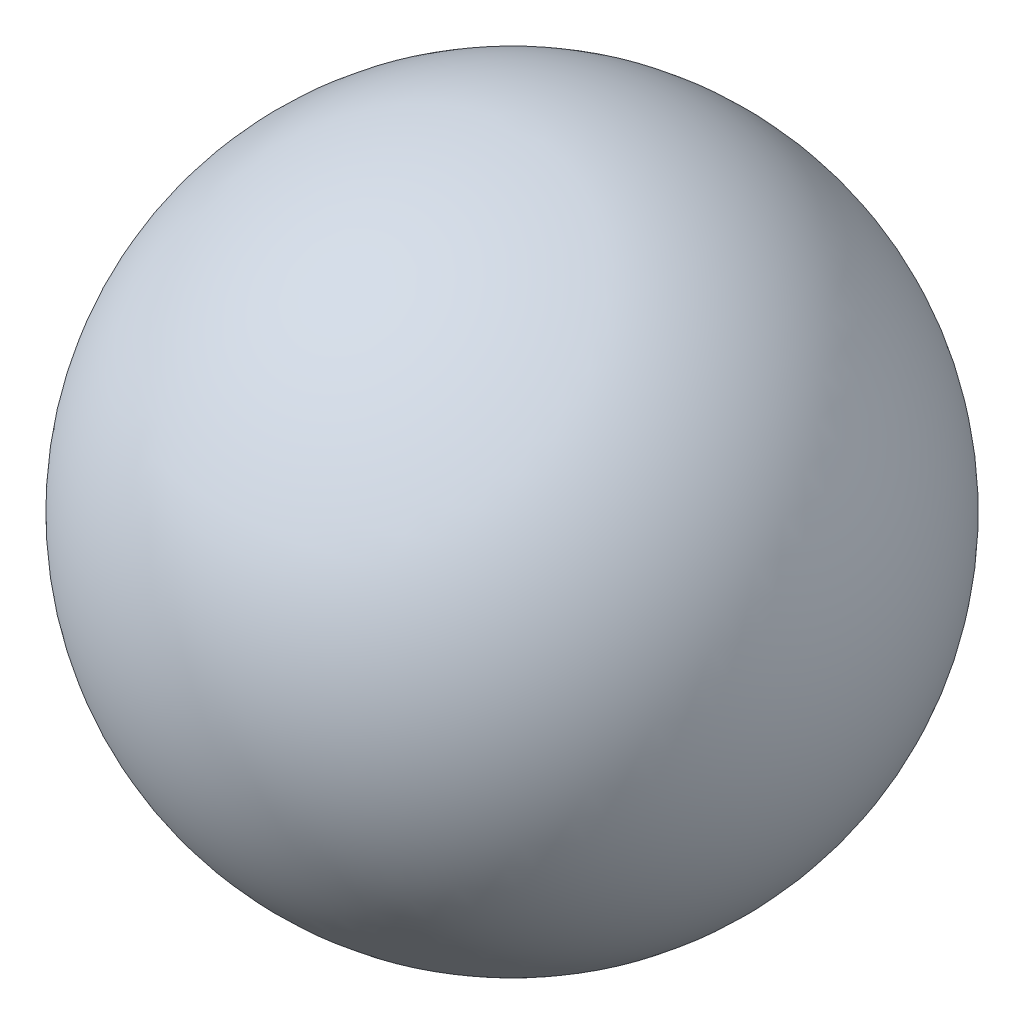
ISO-10303-21;
HEADER;
FILE_DESCRIPTION(('STEP AP214'),'2;1');
FILE_NAME('part.step','',(''),(''),'','','');
FILE_SCHEMA(('AUTOMOTIVE_DESIGN { 1 0 10303 214 1 1 1 1 }'));
ENDSEC;
DATA;
#1=APPLICATION_CONTEXT('core data for automotive mechanical design processes');
#2=APPLICATION_PROTOCOL_DEFINITION('international standard','automotive_design',2000,#1);
#3=PRODUCT_CONTEXT('',#1,'mechanical');
#4=PRODUCT('Part','Part','',(#3));
#5=PRODUCT_RELATED_PRODUCT_CATEGORY('part','',(#4));
#6=PRODUCT_DEFINITION_FORMATION('','',#4);
#7=PRODUCT_DEFINITION_CONTEXT('part definition',#1,'design');
#8=PRODUCT_DEFINITION('design','',#6,#7);
#9=PRODUCT_DEFINITION_SHAPE('','',#8);
#10=(LENGTH_UNIT() NAMED_UNIT(*) SI_UNIT(.MILLI.,.METRE.));
#11=(NAMED_UNIT(*) PLANE_ANGLE_UNIT() SI_UNIT($,.RADIAN.));
#12=(NAMED_UNIT(*) SI_UNIT($,.STERADIAN.) SOLID_ANGLE_UNIT());
#13=UNCERTAINTY_MEASURE_WITH_UNIT(LENGTH_MEASURE(1.E-05),#10,'distance_accuracy_value','');
#14=(GEOMETRIC_REPRESENTATION_CONTEXT(3) GLOBAL_UNCERTAINTY_ASSIGNED_CONTEXT((#13)) GLOBAL_UNIT_ASSIGNED_CONTEXT((#10,
#11,#12)) REPRESENTATION_CONTEXT('',''));
#15=CARTESIAN_POINT('',(0.,0.,0.));
#16=DIRECTION('',(0.,0.,1.));
#17=DIRECTION('',(1.,0.,0.));
#18=AXIS2_PLACEMENT_3D('',#15,#16,#17);
#19=CARTESIAN_POINT('',(0.,0.,0.));
#20=DIRECTION('',(0.,1.,0.));
#21=DIRECTION('',(1.,0.,0.));
#22=AXIS2_PLACEMENT_3D('',#19,#20,#21);
#23=SPHERICAL_SURFACE('',#22,6.8199);
#24=CARTESIAN_POINT('',(0.,6.8199,0.));
#25=VERTEX_POINT('',#24);
#26=VERTEX_LOOP('',#25);
#27=FACE_BOUND('',#26,.T.);
#28=ADVANCED_FACE('F41',(#27),#23,.T.);
#29=CLOSED_SHELL('',(#28));
#30=MANIFOLD_SOLID_BREP('B2',#29);
#31=ADVANCED_BREP_SHAPE_REPRESENTATION('',(#18,#30),#14);
#32=SHAPE_DEFINITION_REPRESENTATION(#9,#31);
ENDSEC;
END-ISO-10303-21;
